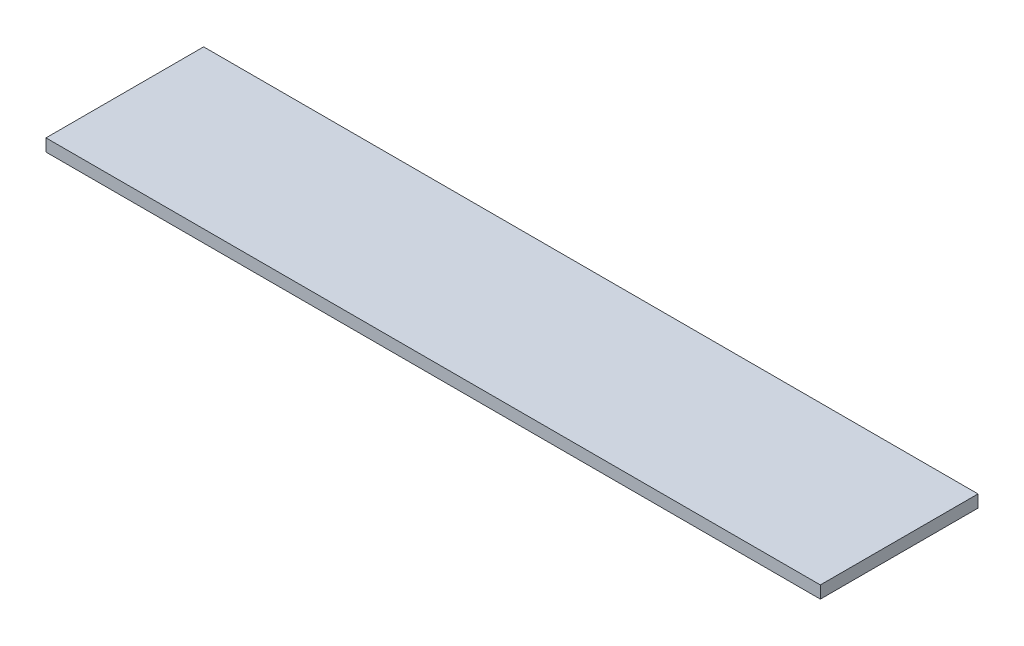
ISO-10303-21;
HEADER;
FILE_DESCRIPTION(('STEP AP214'),'2;1');
FILE_NAME('part.step','',(''),(''),'','','');
FILE_SCHEMA(('AUTOMOTIVE_DESIGN { 1 0 10303 214 1 1 1 1 }'));
ENDSEC;
DATA;
#1=APPLICATION_CONTEXT('core data for automotive mechanical design processes');
#2=APPLICATION_PROTOCOL_DEFINITION('international standard','automotive_design',2000,#1);
#3=PRODUCT_CONTEXT('',#1,'mechanical');
#4=PRODUCT('Part','Part','',(#3));
#5=PRODUCT_RELATED_PRODUCT_CATEGORY('part','',(#4));
#6=PRODUCT_DEFINITION_FORMATION('','',#4);
#7=PRODUCT_DEFINITION_CONTEXT('part definition',#1,'design');
#8=PRODUCT_DEFINITION('design','',#6,#7);
#9=PRODUCT_DEFINITION_SHAPE('','',#8);
#10=(LENGTH_UNIT() NAMED_UNIT(*) SI_UNIT(.MILLI.,.METRE.));
#11=(NAMED_UNIT(*) PLANE_ANGLE_UNIT() SI_UNIT($,.RADIAN.));
#12=(NAMED_UNIT(*) SI_UNIT($,.STERADIAN.) SOLID_ANGLE_UNIT());
#13=UNCERTAINTY_MEASURE_WITH_UNIT(LENGTH_MEASURE(1.E-05),#10,'distance_accuracy_value','');
#14=(GEOMETRIC_REPRESENTATION_CONTEXT(3) GLOBAL_UNCERTAINTY_ASSIGNED_CONTEXT((#13)) GLOBAL_UNIT_ASSIGNED_CONTEXT((#10,
#11,#12)) REPRESENTATION_CONTEXT('',''));
#15=CARTESIAN_POINT('',(0.,0.,0.));
#16=DIRECTION('',(0.,0.,1.));
#17=DIRECTION('',(1.,0.,0.));
#18=AXIS2_PLACEMENT_3D('',#15,#16,#17);
#19=CARTESIAN_POINT('',(-155.082790402034,36.4366756713809,150.843762498003));
#20=DIRECTION('',(1.,0.,0.));
#21=DIRECTION('',(0.,0.,-1.));
#22=AXIS2_PLACEMENT_3D('',#19,#20,#21);
#23=PLANE('',#22);
#24=DIRECTION('',(0.,-1.,0.));
#25=VECTOR('',#24,1.);
#26=CARTESIAN_POINT('',(-155.082790402034,36.4366756713809,0.));
#27=LINE('',#26,#25);
#28=CARTESIAN_POINT('',(-155.082790402034,48.2396458401947,0.));
#29=VERTEX_POINT('',#28);
#30=CARTESIAN_POINT('',(-155.082790402034,36.4366756713809,0.));
#31=VERTEX_POINT('',#30);
#32=EDGE_CURVE('E98',#29,#31,#27,.T.);
#33=ORIENTED_EDGE('',*,*,#32,.T.);
#34=DIRECTION('',(0.,0.,-1.));
#35=VECTOR('',#34,1.);
#36=CARTESIAN_POINT('',(-155.082790402034,36.4366756713809,150.843762498003));
#37=LINE('',#36,#35);
#38=CARTESIAN_POINT('',(-155.082790402034,36.4366756713809,150.843762498003));
#39=VERTEX_POINT('',#38);
#40=EDGE_CURVE('E11',#39,#31,#37,.T.);
#41=ORIENTED_EDGE('',*,*,#40,.F.);
#42=DIRECTION('',(0.,-1.,0.));
#43=VECTOR('',#42,1.);
#44=CARTESIAN_POINT('',(-155.082790402034,36.4366756713809,150.843762498003));
#45=LINE('',#44,#43);
#46=CARTESIAN_POINT('',(-155.082790402034,48.2396458401947,150.843762498003));
#47=VERTEX_POINT('',#46);
#48=EDGE_CURVE('E86',#47,#39,#45,.T.);
#49=ORIENTED_EDGE('',*,*,#48,.F.);
#50=DIRECTION('',(0.,0.,-1.));
#51=VECTOR('',#50,1.);
#52=CARTESIAN_POINT('',(-155.082790402034,48.2396458401947,150.843762498003));
#53=LINE('',#52,#51);
#54=EDGE_CURVE('E94',#47,#29,#53,.T.);
#55=ORIENTED_EDGE('',*,*,#54,.T.);
#56=EDGE_LOOP('',(#33,#41,#49,#55));
#57=FACE_BOUND('',#56,.T.);
#58=ADVANCED_FACE('F35',(#57),#23,.F.);
#59=CARTESIAN_POINT('',(-155.082790402034,36.4366756713809,150.843762498003));
#60=DIRECTION('',(0.,1.,0.));
#61=DIRECTION('',(0.,0.,1.));
#62=AXIS2_PLACEMENT_3D('',#59,#60,#61);
#63=PLANE('',#62);
#64=DIRECTION('',(1.,0.,0.));
#65=VECTOR('',#64,1.);
#66=CARTESIAN_POINT('',(-155.082790402034,36.4366756713809,0.));
#67=LINE('',#66,#65);
#68=CARTESIAN_POINT('',(585.826022824044,36.4366756713809,0.));
#69=VERTEX_POINT('',#68);
#70=EDGE_CURVE('E90',#31,#69,#67,.T.);
#71=ORIENTED_EDGE('',*,*,#70,.T.);
#72=DIRECTION('',(0.,0.,-1.));
#73=VECTOR('',#72,1.);
#74=CARTESIAN_POINT('',(585.826022824044,36.4366756713809,150.843762498003));
#75=LINE('',#74,#73);
#76=CARTESIAN_POINT('',(585.826022824044,36.4366756713809,150.843762498003));
#77=VERTEX_POINT('',#76);
#78=EDGE_CURVE('E43',#77,#69,#75,.T.);
#79=ORIENTED_EDGE('',*,*,#78,.F.);
#80=DIRECTION('',(1.,0.,0.));
#81=VECTOR('',#80,1.);
#82=CARTESIAN_POINT('',(-155.082790402034,36.4366756713809,150.843762498003));
#83=LINE('',#82,#81);
#84=EDGE_CURVE('E81',#39,#77,#83,.T.);
#85=ORIENTED_EDGE('',*,*,#84,.F.);
#86=ORIENTED_EDGE('',*,*,#40,.T.);
#87=EDGE_LOOP('',(#71,#79,#85,#86));
#88=FACE_BOUND('',#87,.T.);
#89=ADVANCED_FACE('F89',(#88),#63,.F.);
#90=CARTESIAN_POINT('',(585.826022824044,36.4366756713809,150.843762498003));
#91=DIRECTION('',(-1.,0.,0.));
#92=DIRECTION('',(0.,0.,1.));
#93=AXIS2_PLACEMENT_3D('',#90,#91,#92);
#94=PLANE('',#93);
#95=DIRECTION('',(0.,1.,0.));
#96=VECTOR('',#95,1.);
#97=CARTESIAN_POINT('',(585.826022824044,36.4366756713809,0.));
#98=LINE('',#97,#96);
#99=CARTESIAN_POINT('',(585.826022824044,48.2396458401947,0.));
#100=VERTEX_POINT('',#99);
#101=EDGE_CURVE('E68',#69,#100,#98,.T.);
#102=ORIENTED_EDGE('',*,*,#101,.T.);
#103=DIRECTION('',(0.,0.,-1.));
#104=VECTOR('',#103,1.);
#105=CARTESIAN_POINT('',(585.826022824044,48.2396458401947,150.843762498003));
#106=LINE('',#105,#104);
#107=CARTESIAN_POINT('',(585.826022824044,48.2396458401947,150.843762498003));
#108=VERTEX_POINT('',#107);
#109=EDGE_CURVE('E91',#108,#100,#106,.T.);
#110=ORIENTED_EDGE('',*,*,#109,.F.);
#111=DIRECTION('',(0.,1.,0.));
#112=VECTOR('',#111,1.);
#113=CARTESIAN_POINT('',(585.826022824044,36.4366756713809,150.843762498003));
#114=LINE('',#113,#112);
#115=EDGE_CURVE('E84',#77,#108,#114,.T.);
#116=ORIENTED_EDGE('',*,*,#115,.F.);
#117=ORIENTED_EDGE('',*,*,#78,.T.);
#118=EDGE_LOOP('',(#102,#110,#116,#117));
#119=FACE_BOUND('',#118,.T.);
#120=ADVANCED_FACE('F92',(#119),#94,.F.);
#121=CARTESIAN_POINT('',(-155.082790402034,48.2396458401947,150.843762498003));
#122=DIRECTION('',(0.,-1.,0.));
#123=DIRECTION('',(0.,0.,-1.));
#124=AXIS2_PLACEMENT_3D('',#121,#122,#123);
#125=PLANE('',#124);
#126=DIRECTION('',(-1.,0.,0.));
#127=VECTOR('',#126,1.);
#128=CARTESIAN_POINT('',(-155.082790402034,48.2396458401947,0.));
#129=LINE('',#128,#127);
#130=EDGE_CURVE('E74',#100,#29,#129,.T.);
#131=ORIENTED_EDGE('',*,*,#130,.T.);
#132=ORIENTED_EDGE('',*,*,#54,.F.);
#133=DIRECTION('',(-1.,0.,0.));
#134=VECTOR('',#133,1.);
#135=CARTESIAN_POINT('',(-155.082790402034,48.2396458401947,150.843762498003));
#136=LINE('',#135,#134);
#137=EDGE_CURVE('E51',#108,#47,#136,.T.);
#138=ORIENTED_EDGE('',*,*,#137,.F.);
#139=ORIENTED_EDGE('',*,*,#109,.T.);
#140=EDGE_LOOP('',(#131,#132,#138,#139));
#141=FACE_BOUND('',#140,.T.);
#142=ADVANCED_FACE('F105',(#141),#125,.F.);
#143=CARTESIAN_POINT('',(0.,0.,150.843762498003));
#144=DIRECTION('',(0.,0.,-1.));
#145=DIRECTION('',(-1.,0.,0.));
#146=AXIS2_PLACEMENT_3D('',#143,#144,#145);
#147=PLANE('',#146);
#148=ORIENTED_EDGE('',*,*,#48,.T.);
#149=ORIENTED_EDGE('',*,*,#84,.T.);
#150=ORIENTED_EDGE('',*,*,#115,.T.);
#151=ORIENTED_EDGE('',*,*,#137,.T.);
#152=EDGE_LOOP('',(#148,#149,#150,#151));
#153=FACE_BOUND('',#152,.T.);
#154=ADVANCED_FACE('F82',(#153),#147,.F.);
#155=CARTESIAN_POINT('',(0.,0.,0.));
#156=DIRECTION('',(0.,0.,-1.));
#157=DIRECTION('',(-1.,0.,0.));
#158=AXIS2_PLACEMENT_3D('',#155,#156,#157);
#159=PLANE('',#158);
#160=ORIENTED_EDGE('',*,*,#32,.F.);
#161=ORIENTED_EDGE('',*,*,#130,.F.);
#162=ORIENTED_EDGE('',*,*,#101,.F.);
#163=ORIENTED_EDGE('',*,*,#70,.F.);
#164=EDGE_LOOP('',(#160,#161,#162,#163));
#165=FACE_BOUND('',#164,.T.);
#166=ADVANCED_FACE('F108',(#165),#159,.T.);
#167=CLOSED_SHELL('',(#58,#89,#120,#142,#154,#166));
#168=MANIFOLD_SOLID_BREP('B2',#167);
#169=ADVANCED_BREP_SHAPE_REPRESENTATION('',(#18,#168),#14);
#170=SHAPE_DEFINITION_REPRESENTATION(#9,#169);
ENDSEC;
END-ISO-10303-21;
